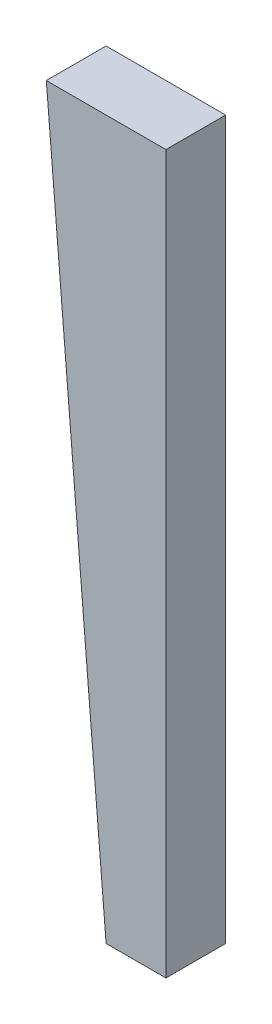
ISO-10303-21;
HEADER;
FILE_DESCRIPTION(('STEP AP214'),'2;1');
FILE_NAME('part.step','',(''),(''),'','','');
FILE_SCHEMA(('AUTOMOTIVE_DESIGN { 1 0 10303 214 1 1 1 1 }'));
ENDSEC;
DATA;
#1=APPLICATION_CONTEXT('core data for automotive mechanical design processes');
#2=APPLICATION_PROTOCOL_DEFINITION('international standard','automotive_design',2000,#1);
#3=PRODUCT_CONTEXT('',#1,'mechanical');
#4=PRODUCT('Part','Part','',(#3));
#5=PRODUCT_RELATED_PRODUCT_CATEGORY('part','',(#4));
#6=PRODUCT_DEFINITION_FORMATION('','',#4);
#7=PRODUCT_DEFINITION_CONTEXT('part definition',#1,'design');
#8=PRODUCT_DEFINITION('design','',#6,#7);
#9=PRODUCT_DEFINITION_SHAPE('','',#8);
#10=(LENGTH_UNIT() NAMED_UNIT(*) SI_UNIT(.MILLI.,.METRE.));
#11=(NAMED_UNIT(*) PLANE_ANGLE_UNIT() SI_UNIT($,.RADIAN.));
#12=(NAMED_UNIT(*) SI_UNIT($,.STERADIAN.) SOLID_ANGLE_UNIT());
#13=UNCERTAINTY_MEASURE_WITH_UNIT(LENGTH_MEASURE(1.E-05),#10,'distance_accuracy_value','');
#14=(GEOMETRIC_REPRESENTATION_CONTEXT(3) GLOBAL_UNCERTAINTY_ASSIGNED_CONTEXT((#13)) GLOBAL_UNIT_ASSIGNED_CONTEXT((#10,
#11,#12)) REPRESENTATION_CONTEXT('',''));
#15=CARTESIAN_POINT('',(0.,0.,0.));
#16=DIRECTION('',(0.,0.,1.));
#17=DIRECTION('',(1.,0.,0.));
#18=AXIS2_PLACEMENT_3D('',#15,#16,#17);
#19=CARTESIAN_POINT('',(0.999999999999999,6.,1.));
#20=DIRECTION('',(0.,-1.,0.));
#21=DIRECTION('',(0.,0.,-1.));
#22=AXIS2_PLACEMENT_3D('',#19,#20,#21);
#23=PLANE('',#22);
#24=DIRECTION('',(-1.,0.,0.));
#25=VECTOR('',#24,1.);
#26=CARTESIAN_POINT('',(0.999999999999999,6.,0.));
#27=LINE('',#26,#25);
#28=CARTESIAN_POINT('',(0.999999999999999,6.,0.));
#29=VERTEX_POINT('',#28);
#30=CARTESIAN_POINT('',(-1.,6.,0.));
#31=VERTEX_POINT('',#30);
#32=EDGE_CURVE('E96',#29,#31,#27,.T.);
#33=ORIENTED_EDGE('',*,*,#32,.T.);
#34=DIRECTION('',(0.,0.,-1.));
#35=VECTOR('',#34,1.);
#36=CARTESIAN_POINT('',(-1.,6.,1.));
#37=LINE('',#36,#35);
#38=CARTESIAN_POINT('',(-1.,6.,1.));
#39=VERTEX_POINT('',#38);
#40=EDGE_CURVE('E11',#39,#31,#37,.T.);
#41=ORIENTED_EDGE('',*,*,#40,.F.);
#42=DIRECTION('',(-1.,0.,0.));
#43=VECTOR('',#42,1.);
#44=CARTESIAN_POINT('',(0.999999999999999,6.,1.));
#45=LINE('',#44,#43);
#46=CARTESIAN_POINT('',(0.999999999999999,6.,1.));
#47=VERTEX_POINT('',#46);
#48=EDGE_CURVE('E84',#47,#39,#45,.T.);
#49=ORIENTED_EDGE('',*,*,#48,.F.);
#50=DIRECTION('',(0.,0.,-1.));
#51=VECTOR('',#50,1.);
#52=CARTESIAN_POINT('',(0.999999999999999,6.,1.));
#53=LINE('',#52,#51);
#54=EDGE_CURVE('E92',#47,#29,#53,.T.);
#55=ORIENTED_EDGE('',*,*,#54,.T.);
#56=EDGE_LOOP('',(#33,#41,#49,#55));
#57=FACE_BOUND('',#56,.T.);
#58=ADVANCED_FACE('F33',(#57),#23,.F.);
#59=CARTESIAN_POINT('',(-1.,6.,1.));
#60=DIRECTION('',(0.99654575824488,0.0830454798537401,0.));
#61=DIRECTION('',(-0.0830454798537401,0.99654575824488,0.));
#62=AXIS2_PLACEMENT_3D('',#59,#60,#61);
#63=PLANE('',#62);
#64=DIRECTION('',(0.0830454798537401,-0.99654575824488,0.));
#65=VECTOR('',#64,1.);
#66=CARTESIAN_POINT('',(-1.,6.,0.));
#67=LINE('',#66,#65);
#68=CARTESIAN_POINT('',(0.,-6.,0.));
#69=VERTEX_POINT('',#68);
#70=EDGE_CURVE('E88',#31,#69,#67,.T.);
#71=ORIENTED_EDGE('',*,*,#70,.T.);
#72=DIRECTION('',(0.,0.,-1.));
#73=VECTOR('',#72,1.);
#74=CARTESIAN_POINT('',(0.,-6.,1.));
#75=LINE('',#74,#73);
#76=CARTESIAN_POINT('',(0.,-6.,1.));
#77=VERTEX_POINT('',#76);
#78=EDGE_CURVE('E41',#77,#69,#75,.T.);
#79=ORIENTED_EDGE('',*,*,#78,.F.);
#80=DIRECTION('',(0.0830454798537401,-0.99654575824488,0.));
#81=VECTOR('',#80,1.);
#82=CARTESIAN_POINT('',(-1.,6.,1.));
#83=LINE('',#82,#81);
#84=EDGE_CURVE('E79',#39,#77,#83,.T.);
#85=ORIENTED_EDGE('',*,*,#84,.F.);
#86=ORIENTED_EDGE('',*,*,#40,.T.);
#87=EDGE_LOOP('',(#71,#79,#85,#86));
#88=FACE_BOUND('',#87,.T.);
#89=ADVANCED_FACE('F87',(#88),#63,.F.);
#90=CARTESIAN_POINT('',(0.,-6.,1.));
#91=DIRECTION('',(0.,1.,0.));
#92=DIRECTION('',(0.,0.,1.));
#93=AXIS2_PLACEMENT_3D('',#90,#91,#92);
#94=PLANE('',#93);
#95=DIRECTION('',(1.,0.,0.));
#96=VECTOR('',#95,1.);
#97=CARTESIAN_POINT('',(0.,-6.,0.));
#98=LINE('',#97,#96);
#99=CARTESIAN_POINT('',(1.,-6.,0.));
#100=VERTEX_POINT('',#99);
#101=EDGE_CURVE('E66',#69,#100,#98,.T.);
#102=ORIENTED_EDGE('',*,*,#101,.T.);
#103=DIRECTION('',(0.,0.,-1.));
#104=VECTOR('',#103,1.);
#105=CARTESIAN_POINT('',(1.,-6.,1.));
#106=LINE('',#105,#104);
#107=CARTESIAN_POINT('',(1.,-6.,1.));
#108=VERTEX_POINT('',#107);
#109=EDGE_CURVE('E89',#108,#100,#106,.T.);
#110=ORIENTED_EDGE('',*,*,#109,.F.);
#111=DIRECTION('',(1.,0.,0.));
#112=VECTOR('',#111,1.);
#113=CARTESIAN_POINT('',(0.,-6.,1.));
#114=LINE('',#113,#112);
#115=EDGE_CURVE('E82',#77,#108,#114,.T.);
#116=ORIENTED_EDGE('',*,*,#115,.F.);
#117=ORIENTED_EDGE('',*,*,#78,.T.);
#118=EDGE_LOOP('',(#102,#110,#116,#117));
#119=FACE_BOUND('',#118,.T.);
#120=ADVANCED_FACE('F90',(#119),#94,.F.);
#121=CARTESIAN_POINT('',(1.,-6.,1.));
#122=DIRECTION('',(-1.,0.,0.));
#123=DIRECTION('',(0.,-1.,0.));
#124=AXIS2_PLACEMENT_3D('',#121,#122,#123);
#125=PLANE('',#124);
#126=DIRECTION('',(0.,1.,0.));
#127=VECTOR('',#126,1.);
#128=CARTESIAN_POINT('',(1.,-6.,0.));
#129=LINE('',#128,#127);
#130=EDGE_CURVE('E72',#100,#29,#129,.T.);
#131=ORIENTED_EDGE('',*,*,#130,.T.);
#132=ORIENTED_EDGE('',*,*,#54,.F.);
#133=DIRECTION('',(0.,1.,0.));
#134=VECTOR('',#133,1.);
#135=CARTESIAN_POINT('',(1.,-6.,1.));
#136=LINE('',#135,#134);
#137=EDGE_CURVE('E49',#108,#47,#136,.T.);
#138=ORIENTED_EDGE('',*,*,#137,.F.);
#139=ORIENTED_EDGE('',*,*,#109,.T.);
#140=EDGE_LOOP('',(#131,#132,#138,#139));
#141=FACE_BOUND('',#140,.T.);
#142=ADVANCED_FACE('F103',(#141),#125,.F.);
#143=CARTESIAN_POINT('',(0.,0.,1.));
#144=DIRECTION('',(0.,0.,-1.));
#145=DIRECTION('',(-1.,0.,0.));
#146=AXIS2_PLACEMENT_3D('',#143,#144,#145);
#147=PLANE('',#146);
#148=ORIENTED_EDGE('',*,*,#48,.T.);
#149=ORIENTED_EDGE('',*,*,#84,.T.);
#150=ORIENTED_EDGE('',*,*,#115,.T.);
#151=ORIENTED_EDGE('',*,*,#137,.T.);
#152=EDGE_LOOP('',(#148,#149,#150,#151));
#153=FACE_BOUND('',#152,.T.);
#154=ADVANCED_FACE('F80',(#153),#147,.F.);
#155=CARTESIAN_POINT('',(0.,0.,0.));
#156=DIRECTION('',(0.,0.,-1.));
#157=DIRECTION('',(-1.,0.,0.));
#158=AXIS2_PLACEMENT_3D('',#155,#156,#157);
#159=PLANE('',#158);
#160=ORIENTED_EDGE('',*,*,#32,.F.);
#161=ORIENTED_EDGE('',*,*,#130,.F.);
#162=ORIENTED_EDGE('',*,*,#101,.F.);
#163=ORIENTED_EDGE('',*,*,#70,.F.);
#164=EDGE_LOOP('',(#160,#161,#162,#163));
#165=FACE_BOUND('',#164,.T.);
#166=ADVANCED_FACE('F106',(#165),#159,.T.);
#167=CLOSED_SHELL('',(#58,#89,#120,#142,#154,#166));
#168=MANIFOLD_SOLID_BREP('B2',#167);
#169=ADVANCED_BREP_SHAPE_REPRESENTATION('',(#18,#168),#14);
#170=SHAPE_DEFINITION_REPRESENTATION(#9,#169);
ENDSEC;
END-ISO-10303-21;
